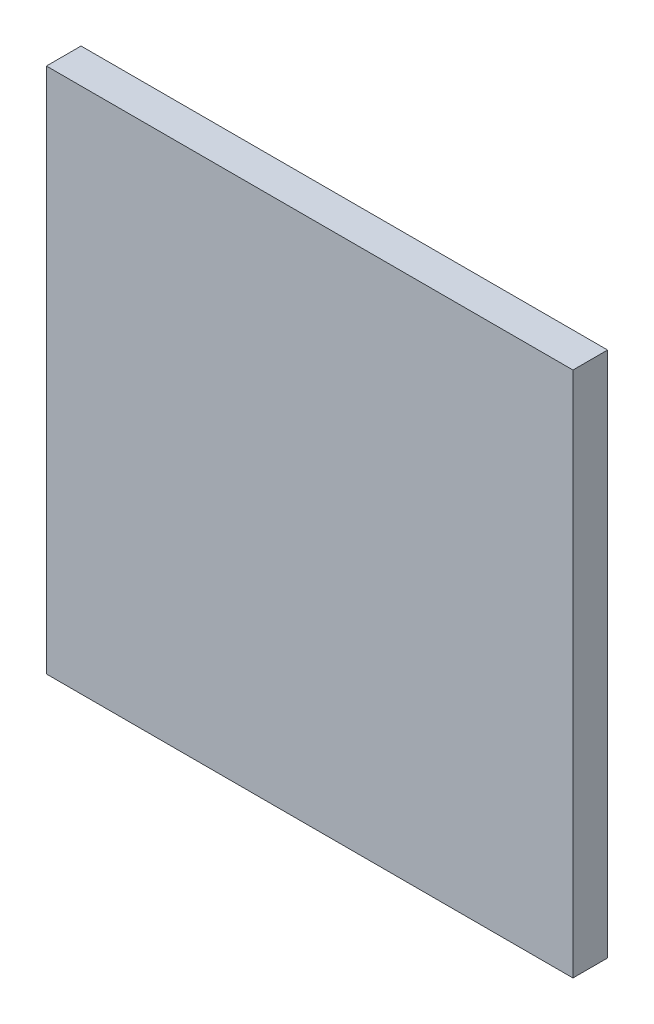
ISO-10303-21;
HEADER;
FILE_DESCRIPTION(('STEP AP214'),'2;1');
FILE_NAME('part.step','',(''),(''),'','','');
FILE_SCHEMA(('AUTOMOTIVE_DESIGN { 1 0 10303 214 1 1 1 1 }'));
ENDSEC;
DATA;
#1=APPLICATION_CONTEXT('core data for automotive mechanical design processes');
#2=APPLICATION_PROTOCOL_DEFINITION('international standard','automotive_design',2000,#1);
#3=PRODUCT_CONTEXT('',#1,'mechanical');
#4=PRODUCT('Part','Part','',(#3));
#5=PRODUCT_RELATED_PRODUCT_CATEGORY('part','',(#4));
#6=PRODUCT_DEFINITION_FORMATION('','',#4);
#7=PRODUCT_DEFINITION_CONTEXT('part definition',#1,'design');
#8=PRODUCT_DEFINITION('design','',#6,#7);
#9=PRODUCT_DEFINITION_SHAPE('','',#8);
#10=(LENGTH_UNIT() NAMED_UNIT(*) SI_UNIT(.MILLI.,.METRE.));
#11=(NAMED_UNIT(*) PLANE_ANGLE_UNIT() SI_UNIT($,.RADIAN.));
#12=(NAMED_UNIT(*) SI_UNIT($,.STERADIAN.) SOLID_ANGLE_UNIT());
#13=UNCERTAINTY_MEASURE_WITH_UNIT(LENGTH_MEASURE(1.E-05),#10,'distance_accuracy_value','');
#14=(GEOMETRIC_REPRESENTATION_CONTEXT(3) GLOBAL_UNCERTAINTY_ASSIGNED_CONTEXT((#13)) GLOBAL_UNIT_ASSIGNED_CONTEXT((#10,
#11,#12)) REPRESENTATION_CONTEXT('',''));
#15=CARTESIAN_POINT('',(0.,0.,0.));
#16=DIRECTION('',(0.,0.,1.));
#17=DIRECTION('',(1.,0.,0.));
#18=AXIS2_PLACEMENT_3D('',#15,#16,#17);
#19=CARTESIAN_POINT('',(0.,0.,0.1));
#20=DIRECTION('',(0.,0.,1.));
#21=DIRECTION('',(1.,0.,0.));
#22=AXIS2_PLACEMENT_3D('',#19,#20,#21);
#23=PLANE('',#22);
#24=DIRECTION('',(0.,1.,0.));
#25=VECTOR('',#24,1.);
#26=CARTESIAN_POINT('',(1.52,0.,0.1));
#27=LINE('',#26,#25);
#28=CARTESIAN_POINT('',(1.52,1.52,0.1));
#29=VERTEX_POINT('',#28);
#30=CARTESIAN_POINT('',(1.52,0.,0.1));
#31=VERTEX_POINT('',#30);
#32=EDGE_CURVE('E76',#29,#31,#27,.F.);
#33=ORIENTED_EDGE('',*,*,#32,.F.);
#34=DIRECTION('',(1.,0.,0.));
#35=VECTOR('',#34,1.);
#36=CARTESIAN_POINT('',(0.,1.52,0.1));
#37=LINE('',#36,#35);
#38=CARTESIAN_POINT('',(0.,1.52,0.1));
#39=VERTEX_POINT('',#38);
#40=EDGE_CURVE('E58',#39,#29,#37,.T.);
#41=ORIENTED_EDGE('',*,*,#40,.F.);
#42=DIRECTION('',(0.,1.,0.));
#43=VECTOR('',#42,1.);
#44=CARTESIAN_POINT('',(0.,0.,0.1));
#45=LINE('',#44,#43);
#46=CARTESIAN_POINT('',(0.,0.,0.1));
#47=VERTEX_POINT('',#46);
#48=EDGE_CURVE('E20',#39,#47,#45,.F.);
#49=ORIENTED_EDGE('',*,*,#48,.T.);
#50=DIRECTION('',(1.,0.,0.));
#51=VECTOR('',#50,1.);
#52=CARTESIAN_POINT('',(0.,0.,0.1));
#53=LINE('',#52,#51);
#54=EDGE_CURVE('E55',#47,#31,#53,.T.);
#55=ORIENTED_EDGE('',*,*,#54,.T.);
#56=EDGE_LOOP('',(#33,#41,#49,#55));
#57=FACE_BOUND('',#56,.T.);
#58=ADVANCED_FACE('F17',(#57),#23,.T.);
#59=CARTESIAN_POINT('',(0.,0.,0.));
#60=DIRECTION('',(1.,0.,0.));
#61=DIRECTION('',(0.,0.,-1.));
#62=AXIS2_PLACEMENT_3D('',#59,#60,#61);
#63=PLANE('',#62);
#64=DIRECTION('',(0.,0.,1.));
#65=VECTOR('',#64,1.);
#66=CARTESIAN_POINT('',(0.,1.52,0.));
#67=LINE('',#66,#65);
#68=CARTESIAN_POINT('',(0.,1.52,0.));
#69=VERTEX_POINT('',#68);
#70=EDGE_CURVE('E78',#69,#39,#67,.T.);
#71=ORIENTED_EDGE('',*,*,#70,.F.);
#72=DIRECTION('',(0.,1.,0.));
#73=VECTOR('',#72,1.);
#74=CARTESIAN_POINT('',(0.,0.,0.));
#75=LINE('',#74,#73);
#76=CARTESIAN_POINT('',(0.,0.,0.));
#77=VERTEX_POINT('',#76);
#78=EDGE_CURVE('E73',#69,#77,#75,.F.);
#79=ORIENTED_EDGE('',*,*,#78,.T.);
#80=DIRECTION('',(0.,0.,1.));
#81=VECTOR('',#80,1.);
#82=CARTESIAN_POINT('',(0.,0.,0.));
#83=LINE('',#82,#81);
#84=EDGE_CURVE('E63',#77,#47,#83,.T.);
#85=ORIENTED_EDGE('',*,*,#84,.T.);
#86=ORIENTED_EDGE('',*,*,#48,.F.);
#87=EDGE_LOOP('',(#71,#79,#85,#86));
#88=FACE_BOUND('',#87,.T.);
#89=ADVANCED_FACE('F72',(#88),#63,.F.);
#90=CARTESIAN_POINT('',(0.,0.,0.));
#91=DIRECTION('',(0.,1.,0.));
#92=DIRECTION('',(0.,0.,1.));
#93=AXIS2_PLACEMENT_3D('',#90,#91,#92);
#94=PLANE('',#93);
#95=ORIENTED_EDGE('',*,*,#54,.F.);
#96=ORIENTED_EDGE('',*,*,#84,.F.);
#97=DIRECTION('',(1.,0.,0.));
#98=VECTOR('',#97,1.);
#99=CARTESIAN_POINT('',(0.,0.,0.));
#100=LINE('',#99,#98);
#101=CARTESIAN_POINT('',(1.52,0.,0.));
#102=VERTEX_POINT('',#101);
#103=EDGE_CURVE('E83',#77,#102,#100,.T.);
#104=ORIENTED_EDGE('',*,*,#103,.T.);
#105=DIRECTION('',(0.,0.,-1.));
#106=VECTOR('',#105,1.);
#107=CARTESIAN_POINT('',(1.52,0.,0.));
#108=LINE('',#107,#106);
#109=EDGE_CURVE('E69',#31,#102,#108,.T.);
#110=ORIENTED_EDGE('',*,*,#109,.F.);
#111=EDGE_LOOP('',(#95,#96,#104,#110));
#112=FACE_BOUND('',#111,.T.);
#113=ADVANCED_FACE('F66',(#112),#94,.F.);
#114=CARTESIAN_POINT('',(1.52,0.,0.));
#115=DIRECTION('',(1.,0.,0.));
#116=DIRECTION('',(0.,0.,-1.));
#117=AXIS2_PLACEMENT_3D('',#114,#115,#116);
#118=PLANE('',#117);
#119=DIRECTION('',(0.,0.,1.));
#120=VECTOR('',#119,1.);
#121=CARTESIAN_POINT('',(1.52,1.52,0.));
#122=LINE('',#121,#120);
#123=CARTESIAN_POINT('',(1.52,1.52,0.));
#124=VERTEX_POINT('',#123);
#125=EDGE_CURVE('E34',#29,#124,#122,.F.);
#126=ORIENTED_EDGE('',*,*,#125,.F.);
#127=ORIENTED_EDGE('',*,*,#32,.T.);
#128=ORIENTED_EDGE('',*,*,#109,.T.);
#129=DIRECTION('',(0.,1.,0.));
#130=VECTOR('',#129,1.);
#131=CARTESIAN_POINT('',(1.52,0.,0.));
#132=LINE('',#131,#130);
#133=EDGE_CURVE('E26',#102,#124,#132,.T.);
#134=ORIENTED_EDGE('',*,*,#133,.T.);
#135=EDGE_LOOP('',(#126,#127,#128,#134));
#136=FACE_BOUND('',#135,.T.);
#137=ADVANCED_FACE('F88',(#136),#118,.T.);
#138=CARTESIAN_POINT('',(0.,1.52,0.));
#139=DIRECTION('',(0.,1.,0.));
#140=DIRECTION('',(0.,0.,1.));
#141=AXIS2_PLACEMENT_3D('',#138,#139,#140);
#142=PLANE('',#141);
#143=ORIENTED_EDGE('',*,*,#40,.T.);
#144=ORIENTED_EDGE('',*,*,#125,.T.);
#145=DIRECTION('',(1.,0.,0.));
#146=VECTOR('',#145,1.);
#147=CARTESIAN_POINT('',(0.,1.52,0.));
#148=LINE('',#147,#146);
#149=EDGE_CURVE('E11',#124,#69,#148,.F.);
#150=ORIENTED_EDGE('',*,*,#149,.T.);
#151=ORIENTED_EDGE('',*,*,#70,.T.);
#152=EDGE_LOOP('',(#143,#144,#150,#151));
#153=FACE_BOUND('',#152,.T.);
#154=ADVANCED_FACE('F91',(#153),#142,.T.);
#155=CARTESIAN_POINT('',(0.,0.,0.));
#156=DIRECTION('',(0.,0.,1.));
#157=DIRECTION('',(1.,0.,0.));
#158=AXIS2_PLACEMENT_3D('',#155,#156,#157);
#159=PLANE('',#158);
#160=ORIENTED_EDGE('',*,*,#133,.F.);
#161=ORIENTED_EDGE('',*,*,#103,.F.);
#162=ORIENTED_EDGE('',*,*,#78,.F.);
#163=ORIENTED_EDGE('',*,*,#149,.F.);
#164=EDGE_LOOP('',(#160,#161,#162,#163));
#165=FACE_BOUND('',#164,.T.);
#166=ADVANCED_FACE('F90',(#165),#159,.F.);
#167=CLOSED_SHELL('',(#58,#89,#113,#137,#154,#166));
#168=MANIFOLD_SOLID_BREP('B1',#167);
#169=ADVANCED_BREP_SHAPE_REPRESENTATION('',(#18,#168),#14);
#170=SHAPE_DEFINITION_REPRESENTATION(#9,#169);
ENDSEC;
END-ISO-10303-21;
